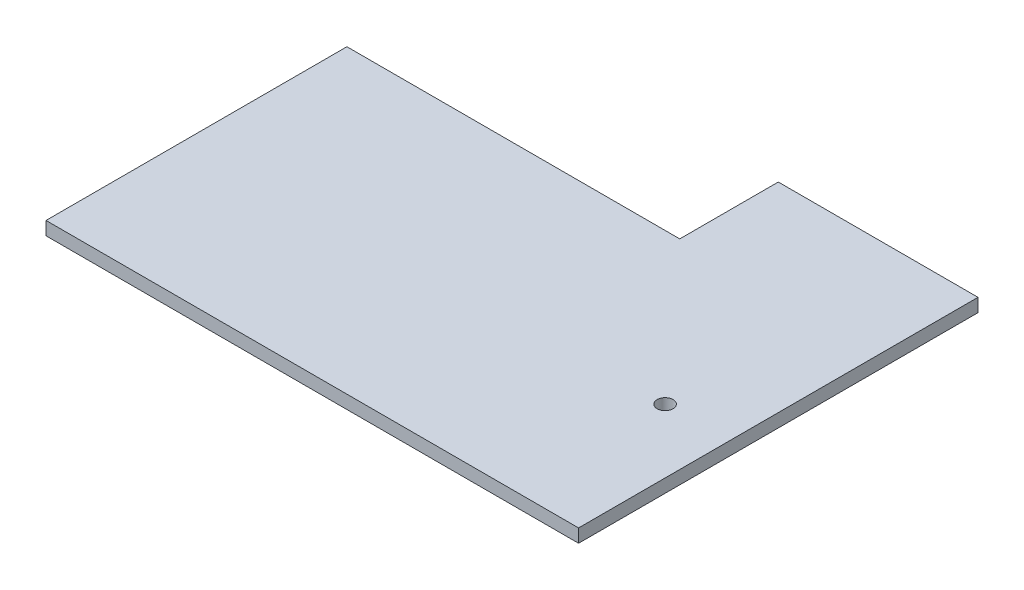
ISO-10303-21;
HEADER;
FILE_DESCRIPTION(('STEP AP214'),'2;1');
FILE_NAME('part.step','',(''),(''),'','','');
FILE_SCHEMA(('AUTOMOTIVE_DESIGN { 1 0 10303 214 1 1 1 1 }'));
ENDSEC;
DATA;
#1=APPLICATION_CONTEXT('core data for automotive mechanical design processes');
#2=APPLICATION_PROTOCOL_DEFINITION('international standard','automotive_design',2000,#1);
#3=PRODUCT_CONTEXT('',#1,'mechanical');
#4=PRODUCT('Part','Part','',(#3));
#5=PRODUCT_RELATED_PRODUCT_CATEGORY('part','',(#4));
#6=PRODUCT_DEFINITION_FORMATION('','',#4);
#7=PRODUCT_DEFINITION_CONTEXT('part definition',#1,'design');
#8=PRODUCT_DEFINITION('design','',#6,#7);
#9=PRODUCT_DEFINITION_SHAPE('','',#8);
#10=(LENGTH_UNIT() NAMED_UNIT(*) SI_UNIT(.MILLI.,.METRE.));
#11=(NAMED_UNIT(*) PLANE_ANGLE_UNIT() SI_UNIT($,.RADIAN.));
#12=(NAMED_UNIT(*) SI_UNIT($,.STERADIAN.) SOLID_ANGLE_UNIT());
#13=UNCERTAINTY_MEASURE_WITH_UNIT(LENGTH_MEASURE(1.E-05),#10,'distance_accuracy_value','');
#14=(GEOMETRIC_REPRESENTATION_CONTEXT(3) GLOBAL_UNCERTAINTY_ASSIGNED_CONTEXT((#13)) GLOBAL_UNIT_ASSIGNED_CONTEXT((#10,
#11,#12)) REPRESENTATION_CONTEXT('',''));
#15=CARTESIAN_POINT('',(0.,0.,0.));
#16=DIRECTION('',(0.,0.,1.));
#17=DIRECTION('',(1.,0.,0.));
#18=AXIS2_PLACEMENT_3D('',#15,#16,#17);
#19=CARTESIAN_POINT('',(91.2344460808378,-5.,0.));
#20=DIRECTION('',(-1.,0.,0.));
#21=DIRECTION('',(0.,0.,1.));
#22=AXIS2_PLACEMENT_3D('',#19,#20,#21);
#23=PLANE('',#22);
#24=DIRECTION('',(0.,0.,1.));
#25=VECTOR('',#24,1.);
#26=CARTESIAN_POINT('',(91.2344460808378,0.,0.));
#27=LINE('',#26,#25);
#28=CARTESIAN_POINT('',(91.2344460808378,0.,-115.));
#29=VERTEX_POINT('',#28);
#30=CARTESIAN_POINT('',(91.2344460808378,0.,35.));
#31=VERTEX_POINT('',#30);
#32=EDGE_CURVE('E141',#29,#31,#27,.T.);
#33=ORIENTED_EDGE('',*,*,#32,.T.);
#34=DIRECTION('',(0.,1.,0.));
#35=VECTOR('',#34,1.);
#36=CARTESIAN_POINT('',(91.2344460808378,-5.,35.));
#37=LINE('',#36,#35);
#38=CARTESIAN_POINT('',(91.2344460808378,-5.,35.));
#39=VERTEX_POINT('',#38);
#40=EDGE_CURVE('E11',#39,#31,#37,.T.);
#41=ORIENTED_EDGE('',*,*,#40,.F.);
#42=DIRECTION('',(0.,0.,1.));
#43=VECTOR('',#42,1.);
#44=CARTESIAN_POINT('',(91.2344460808378,-5.,0.));
#45=LINE('',#44,#43);
#46=CARTESIAN_POINT('',(91.2344460808378,-5.,-115.));
#47=VERTEX_POINT('',#46);
#48=EDGE_CURVE('E163',#47,#39,#45,.T.);
#49=ORIENTED_EDGE('',*,*,#48,.F.);
#50=DIRECTION('',(0.,1.,0.));
#51=VECTOR('',#50,1.);
#52=CARTESIAN_POINT('',(91.2344460808378,-5.,-115.));
#53=LINE('',#52,#51);
#54=EDGE_CURVE('E48',#47,#29,#53,.T.);
#55=ORIENTED_EDGE('',*,*,#54,.T.);
#56=EDGE_LOOP('',(#33,#41,#49,#55));
#57=FACE_BOUND('',#56,.T.);
#58=ADVANCED_FACE('F45',(#57),#23,.F.);
#59=CARTESIAN_POINT('',(0.,-5.,35.));
#60=DIRECTION('',(0.,0.,-1.));
#61=DIRECTION('',(-1.,0.,0.));
#62=AXIS2_PLACEMENT_3D('',#59,#60,#61);
#63=PLANE('',#62);
#64=DIRECTION('',(-1.,0.,0.));
#65=VECTOR('',#64,1.);
#66=CARTESIAN_POINT('',(0.,0.,35.));
#67=LINE('',#66,#65);
#68=CARTESIAN_POINT('',(-108.765553919162,0.,35.));
#69=VERTEX_POINT('',#68);
#70=EDGE_CURVE('E83',#31,#69,#67,.T.);
#71=ORIENTED_EDGE('',*,*,#70,.T.);
#72=DIRECTION('',(0.,1.,0.));
#73=VECTOR('',#72,1.);
#74=CARTESIAN_POINT('',(-108.765553919162,-5.,35.));
#75=LINE('',#74,#73);
#76=CARTESIAN_POINT('',(-108.765553919162,-5.,35.));
#77=VERTEX_POINT('',#76);
#78=EDGE_CURVE('E55',#77,#69,#75,.T.);
#79=ORIENTED_EDGE('',*,*,#78,.F.);
#80=DIRECTION('',(-1.,0.,0.));
#81=VECTOR('',#80,1.);
#82=CARTESIAN_POINT('',(0.,-5.,35.));
#83=LINE('',#82,#81);
#84=EDGE_CURVE('E63',#39,#77,#83,.T.);
#85=ORIENTED_EDGE('',*,*,#84,.F.);
#86=ORIENTED_EDGE('',*,*,#40,.T.);
#87=EDGE_LOOP('',(#71,#79,#85,#86));
#88=FACE_BOUND('',#87,.T.);
#89=ADVANCED_FACE('F190',(#88),#63,.F.);
#90=CARTESIAN_POINT('',(-108.765553919162,-5.,0.));
#91=DIRECTION('',(1.,0.,0.));
#92=DIRECTION('',(0.,0.,-1.));
#93=AXIS2_PLACEMENT_3D('',#90,#91,#92);
#94=PLANE('',#93);
#95=DIRECTION('',(0.,0.,-1.));
#96=VECTOR('',#95,1.);
#97=CARTESIAN_POINT('',(-108.765553919162,0.,0.));
#98=LINE('',#97,#96);
#99=CARTESIAN_POINT('',(-108.765553919162,0.,-78.));
#100=VERTEX_POINT('',#99);
#101=EDGE_CURVE('E119',#69,#100,#98,.T.);
#102=ORIENTED_EDGE('',*,*,#101,.T.);
#103=DIRECTION('',(0.,1.,0.));
#104=VECTOR('',#103,1.);
#105=CARTESIAN_POINT('',(-108.765553919162,-5.,-78.));
#106=LINE('',#105,#104);
#107=CARTESIAN_POINT('',(-108.765553919162,-5.,-78.));
#108=VERTEX_POINT('',#107);
#109=EDGE_CURVE('E117',#108,#100,#106,.T.);
#110=ORIENTED_EDGE('',*,*,#109,.F.);
#111=DIRECTION('',(0.,0.,-1.));
#112=VECTOR('',#111,1.);
#113=CARTESIAN_POINT('',(-108.765553919162,-5.,0.));
#114=LINE('',#113,#112);
#115=EDGE_CURVE('E105',#77,#108,#114,.T.);
#116=ORIENTED_EDGE('',*,*,#115,.F.);
#117=ORIENTED_EDGE('',*,*,#78,.T.);
#118=EDGE_LOOP('',(#102,#110,#116,#117));
#119=FACE_BOUND('',#118,.T.);
#120=ADVANCED_FACE('F118',(#119),#94,.F.);
#121=CARTESIAN_POINT('',(0.,-5.,-78.));
#122=DIRECTION('',(0.,0.,-1.));
#123=DIRECTION('',(-1.,0.,0.));
#124=AXIS2_PLACEMENT_3D('',#121,#122,#123);
#125=PLANE('',#124);
#126=DIRECTION('',(-1.,0.,0.));
#127=VECTOR('',#126,1.);
#128=CARTESIAN_POINT('',(0.,0.,-78.));
#129=LINE('',#128,#127);
#130=CARTESIAN_POINT('',(16.2344460808378,0.,-78.));
#131=VERTEX_POINT('',#130);
#132=EDGE_CURVE('E153',#131,#100,#129,.T.);
#133=ORIENTED_EDGE('',*,*,#132,.F.);
#134=DIRECTION('',(0.,1.,0.));
#135=VECTOR('',#134,1.);
#136=CARTESIAN_POINT('',(16.2344460808378,-5.,-78.));
#137=LINE('',#136,#135);
#138=CARTESIAN_POINT('',(16.2344460808378,-5.,-78.));
#139=VERTEX_POINT('',#138);
#140=EDGE_CURVE('E124',#139,#131,#137,.T.);
#141=ORIENTED_EDGE('',*,*,#140,.F.);
#142=DIRECTION('',(-1.,0.,0.));
#143=VECTOR('',#142,1.);
#144=CARTESIAN_POINT('',(0.,-5.,-78.));
#145=LINE('',#144,#143);
#146=EDGE_CURVE('E111',#139,#108,#145,.T.);
#147=ORIENTED_EDGE('',*,*,#146,.T.);
#148=ORIENTED_EDGE('',*,*,#109,.T.);
#149=EDGE_LOOP('',(#133,#141,#147,#148));
#150=FACE_BOUND('',#149,.T.);
#151=ADVANCED_FACE('F126',(#150),#125,.T.);
#152=CARTESIAN_POINT('',(16.2344460808378,-5.,0.));
#153=DIRECTION('',(-1.,0.,0.));
#154=DIRECTION('',(0.,0.,1.));
#155=AXIS2_PLACEMENT_3D('',#152,#153,#154);
#156=PLANE('',#155);
#157=DIRECTION('',(0.,0.,1.));
#158=VECTOR('',#157,1.);
#159=CARTESIAN_POINT('',(16.2344460808378,0.,0.));
#160=LINE('',#159,#158);
#161=CARTESIAN_POINT('',(16.2344460808378,0.,-115.));
#162=VERTEX_POINT('',#161);
#163=EDGE_CURVE('E149',#162,#131,#160,.T.);
#164=ORIENTED_EDGE('',*,*,#163,.F.);
#165=DIRECTION('',(0.,1.,0.));
#166=VECTOR('',#165,1.);
#167=CARTESIAN_POINT('',(16.2344460808378,-5.,-115.));
#168=LINE('',#167,#166);
#169=CARTESIAN_POINT('',(16.2344460808378,-5.,-115.));
#170=VERTEX_POINT('',#169);
#171=EDGE_CURVE('E168',#170,#162,#168,.T.);
#172=ORIENTED_EDGE('',*,*,#171,.F.);
#173=DIRECTION('',(0.,0.,1.));
#174=VECTOR('',#173,1.);
#175=CARTESIAN_POINT('',(16.2344460808378,-5.,0.));
#176=LINE('',#175,#174);
#177=EDGE_CURVE('E128',#170,#139,#176,.T.);
#178=ORIENTED_EDGE('',*,*,#177,.T.);
#179=ORIENTED_EDGE('',*,*,#140,.T.);
#180=EDGE_LOOP('',(#164,#172,#178,#179));
#181=FACE_BOUND('',#180,.T.);
#182=ADVANCED_FACE('F180',(#181),#156,.T.);
#183=CARTESIAN_POINT('',(0.,-5.,-115.));
#184=DIRECTION('',(0.,0.,-1.));
#185=DIRECTION('',(-1.,0.,0.));
#186=AXIS2_PLACEMENT_3D('',#183,#184,#185);
#187=PLANE('',#186);
#188=DIRECTION('',(-1.,0.,0.));
#189=VECTOR('',#188,1.);
#190=CARTESIAN_POINT('',(0.,0.,-115.));
#191=LINE('',#190,#189);
#192=EDGE_CURVE('E145',#29,#162,#191,.T.);
#193=ORIENTED_EDGE('',*,*,#192,.F.);
#194=ORIENTED_EDGE('',*,*,#54,.F.);
#195=DIRECTION('',(-1.,0.,0.));
#196=VECTOR('',#195,1.);
#197=CARTESIAN_POINT('',(0.,-5.,-115.));
#198=LINE('',#197,#196);
#199=EDGE_CURVE('E131',#47,#170,#198,.T.);
#200=ORIENTED_EDGE('',*,*,#199,.T.);
#201=ORIENTED_EDGE('',*,*,#171,.T.);
#202=EDGE_LOOP('',(#193,#194,#200,#201));
#203=FACE_BOUND('',#202,.T.);
#204=ADVANCED_FACE('F177',(#203),#187,.T.);
#205=CARTESIAN_POINT('',(67.2344460808378,-5.,-21.5));
#206=DIRECTION('',(0.,1.,0.));
#207=DIRECTION('',(0.,0.,1.));
#208=AXIS2_PLACEMENT_3D('',#205,#206,#207);
#209=CYLINDRICAL_SURFACE('',#208,3.00000000000001);
#210=CARTESIAN_POINT('',(67.2344460808378,-5.,-21.5));
#211=DIRECTION('',(0.,1.,0.));
#212=DIRECTION('',(0.,0.,1.));
#213=AXIS2_PLACEMENT_3D('',#210,#211,#212);
#214=CIRCLE('',#213,3.00000000000001);
#215=CARTESIAN_POINT('',(67.2344460808378,-5.,-18.5));
#216=VERTEX_POINT('',#215);
#217=EDGE_CURVE('E137',#216,#216,#214,.T.);
#218=ORIENTED_EDGE('',*,*,#217,.F.);
#219=EDGE_LOOP('',(#218));
#220=FACE_BOUND('',#219,.T.);
#221=CARTESIAN_POINT('',(67.2344460808378,0.,-21.5));
#222=DIRECTION('',(0.,1.,0.));
#223=DIRECTION('',(0.,0.,1.));
#224=AXIS2_PLACEMENT_3D('',#221,#222,#223);
#225=CIRCLE('',#224,3.00000000000001);
#226=CARTESIAN_POINT('',(67.2344460808378,0.,-18.5));
#227=VERTEX_POINT('',#226);
#228=EDGE_CURVE('E160',#227,#227,#225,.T.);
#229=ORIENTED_EDGE('',*,*,#228,.T.);
#230=EDGE_LOOP('',(#229));
#231=FACE_BOUND('',#230,.T.);
#232=ADVANCED_FACE('F179',(#220,#231),#209,.F.);
#233=CARTESIAN_POINT('',(0.,-5.,0.));
#234=DIRECTION('',(0.,1.,0.));
#235=DIRECTION('',(0.,0.,1.));
#236=AXIS2_PLACEMENT_3D('',#233,#234,#235);
#237=PLANE('',#236);
#238=ORIENTED_EDGE('',*,*,#48,.T.);
#239=ORIENTED_EDGE('',*,*,#84,.T.);
#240=ORIENTED_EDGE('',*,*,#115,.T.);
#241=ORIENTED_EDGE('',*,*,#146,.F.);
#242=ORIENTED_EDGE('',*,*,#177,.F.);
#243=ORIENTED_EDGE('',*,*,#199,.F.);
#244=EDGE_LOOP('',(#238,#239,#240,#241,#242,#243));
#245=FACE_BOUND('',#244,.T.);
#246=ORIENTED_EDGE('',*,*,#217,.T.);
#247=EDGE_LOOP('',(#246));
#248=FACE_BOUND('',#247,.T.);
#249=ADVANCED_FACE('F107',(#245,#248),#237,.F.);
#250=CARTESIAN_POINT('',(0.,0.,0.));
#251=DIRECTION('',(0.,1.,0.));
#252=DIRECTION('',(0.,0.,1.));
#253=AXIS2_PLACEMENT_3D('',#250,#251,#252);
#254=PLANE('',#253);
#255=ORIENTED_EDGE('',*,*,#32,.F.);
#256=ORIENTED_EDGE('',*,*,#192,.T.);
#257=ORIENTED_EDGE('',*,*,#163,.T.);
#258=ORIENTED_EDGE('',*,*,#132,.T.);
#259=ORIENTED_EDGE('',*,*,#101,.F.);
#260=ORIENTED_EDGE('',*,*,#70,.F.);
#261=EDGE_LOOP('',(#255,#256,#257,#258,#259,#260));
#262=FACE_BOUND('',#261,.T.);
#263=ORIENTED_EDGE('',*,*,#228,.F.);
#264=EDGE_LOOP('',(#263));
#265=FACE_BOUND('',#264,.T.);
#266=ADVANCED_FACE('F175',(#262,#265),#254,.T.);
#267=CLOSED_SHELL('',(#58,#89,#120,#151,#182,#204,#232,#249,#266));
#268=MANIFOLD_SOLID_BREP('B2',#267);
#269=ADVANCED_BREP_SHAPE_REPRESENTATION('',(#18,#268),#14);
#270=SHAPE_DEFINITION_REPRESENTATION(#9,#269);
ENDSEC;
END-ISO-10303-21;
